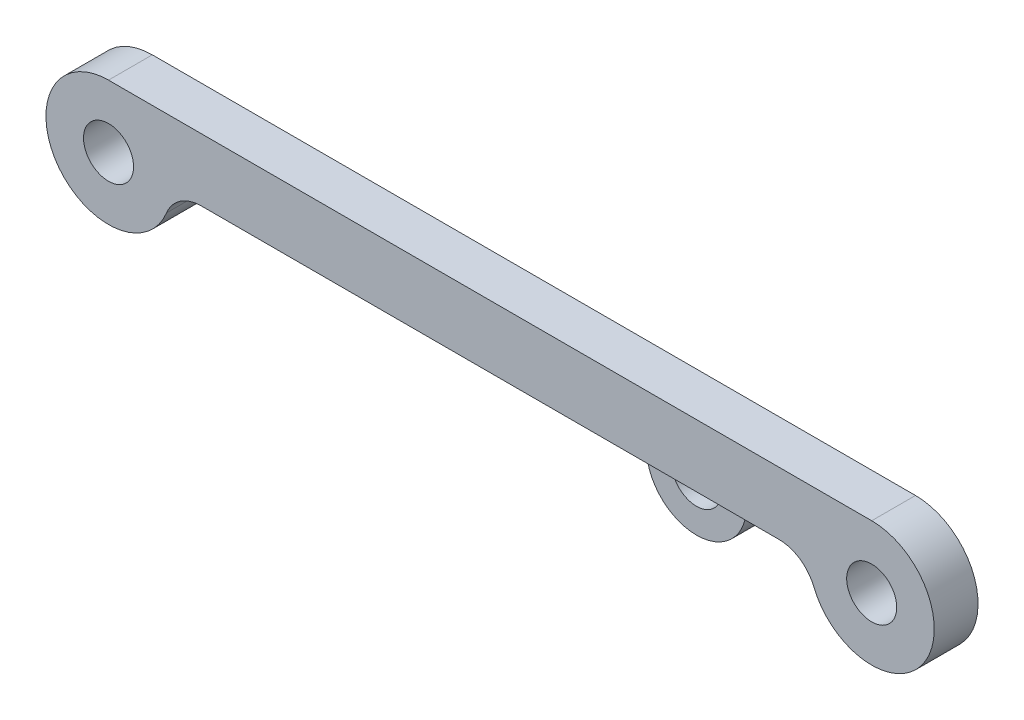
ISO-10303-21;
HEADER;
FILE_DESCRIPTION(('STEP AP214'),'2;1');
FILE_NAME('part.step','',(''),(''),'','','');
FILE_SCHEMA(('AUTOMOTIVE_DESIGN { 1 0 10303 214 1 1 1 1 }'));
ENDSEC;
DATA;
#1=APPLICATION_CONTEXT('core data for automotive mechanical design processes');
#2=APPLICATION_PROTOCOL_DEFINITION('international standard','automotive_design',2000,#1);
#3=PRODUCT_CONTEXT('',#1,'mechanical');
#4=PRODUCT('Part','Part','',(#3));
#5=PRODUCT_RELATED_PRODUCT_CATEGORY('part','',(#4));
#6=PRODUCT_DEFINITION_FORMATION('','',#4);
#7=PRODUCT_DEFINITION_CONTEXT('part definition',#1,'design');
#8=PRODUCT_DEFINITION('design','',#6,#7);
#9=PRODUCT_DEFINITION_SHAPE('','',#8);
#10=(LENGTH_UNIT() NAMED_UNIT(*) SI_UNIT(.MILLI.,.METRE.));
#11=(NAMED_UNIT(*) PLANE_ANGLE_UNIT() SI_UNIT($,.RADIAN.));
#12=(NAMED_UNIT(*) SI_UNIT($,.STERADIAN.) SOLID_ANGLE_UNIT());
#13=UNCERTAINTY_MEASURE_WITH_UNIT(LENGTH_MEASURE(1.E-05),#10,'distance_accuracy_value','');
#14=(GEOMETRIC_REPRESENTATION_CONTEXT(3) GLOBAL_UNCERTAINTY_ASSIGNED_CONTEXT((#13)) GLOBAL_UNIT_ASSIGNED_CONTEXT((#10,
#11,#12)) REPRESENTATION_CONTEXT('',''));
#15=CARTESIAN_POINT('',(0.,0.,0.));
#16=DIRECTION('',(0.,0.,1.));
#17=DIRECTION('',(1.,0.,0.));
#18=AXIS2_PLACEMENT_3D('',#15,#16,#17);
#19=CARTESIAN_POINT('',(-55.8049486568332,-0.499999999999997,3.5));
#20=DIRECTION('',(0.,1.,0.));
#21=DIRECTION('',(0.,0.,1.));
#22=AXIS2_PLACEMENT_3D('',#19,#20,#21);
#23=PLANE('',#22);
#24=DIRECTION('',(0.,0.,1.));
#25=VECTOR('',#24,1.);
#26=CARTESIAN_POINT('',(-12.3221676583625,-0.499999999999997,3.5));
#27=LINE('',#26,#25);
#28=CARTESIAN_POINT('',(-12.3221676583625,-0.499999999999997,2.5));
#29=VERTEX_POINT('',#28);
#30=CARTESIAN_POINT('',(-12.3221676583625,-0.499999999999997,0.5));
#31=VERTEX_POINT('',#30);
#32=EDGE_CURVE('E253',#29,#31,#27,.F.);
#33=ORIENTED_EDGE('',*,*,#32,.T.);
#34=DIRECTION('',(1.,0.,0.));
#35=VECTOR('',#34,1.);
#36=CARTESIAN_POINT('',(-55.8049486568332,-0.499999999999997,0.5));
#37=LINE('',#36,#35);
#38=CARTESIAN_POINT('',(-15.2211471439288,-0.499999999999997,0.5));
#39=VERTEX_POINT('',#38);
#40=EDGE_CURVE('E250',#39,#31,#37,.T.);
#41=ORIENTED_EDGE('',*,*,#40,.F.);
#42=DIRECTION('',(0.,0.,1.));
#43=VECTOR('',#42,1.);
#44=CARTESIAN_POINT('',(-15.2211471439288,-0.499999999999997,0.5));
#45=LINE('',#44,#43);
#46=CARTESIAN_POINT('',(-15.2211471439288,-0.499999999999997,2.5));
#47=VERTEX_POINT('',#46);
#48=EDGE_CURVE('E137',#39,#47,#45,.T.);
#49=ORIENTED_EDGE('',*,*,#48,.T.);
#50=DIRECTION('',(1.,0.,0.));
#51=VECTOR('',#50,1.);
#52=CARTESIAN_POINT('',(-55.8049486568332,-0.499999999999997,2.5));
#53=LINE('',#52,#51);
#54=EDGE_CURVE('E245',#47,#29,#53,.T.);
#55=ORIENTED_EDGE('',*,*,#54,.T.);
#56=EDGE_LOOP('',(#33,#41,#49,#55));
#57=FACE_BOUND('',#56,.T.);
#58=DIRECTION('',(1.,0.,0.));
#59=VECTOR('',#58,1.);
#60=CARTESIAN_POINT('',(-55.8049486568332,-0.499999999999997,0.));
#61=LINE('',#60,#59);
#62=CARTESIAN_POINT('',(-55.8049486568332,-0.499999999999997,0.));
#63=VERTEX_POINT('',#62);
#64=CARTESIAN_POINT('',(-9.63734563102448,-0.499999999999997,0.));
#65=VERTEX_POINT('',#64);
#66=EDGE_CURVE('E208',#63,#65,#61,.T.);
#67=ORIENTED_EDGE('',*,*,#66,.T.);
#68=DIRECTION('',(0.,0.,-1.));
#69=VECTOR('',#68,1.);
#70=CARTESIAN_POINT('',(-9.63734563102448,-0.499999999999997,3.5));
#71=LINE('',#70,#69);
#72=CARTESIAN_POINT('',(-9.63734563102448,-0.499999999999997,3.5));
#73=VERTEX_POINT('',#72);
#74=EDGE_CURVE('E237',#73,#65,#71,.T.);
#75=ORIENTED_EDGE('',*,*,#74,.F.);
#76=DIRECTION('',(1.,0.,0.));
#77=VECTOR('',#76,1.);
#78=CARTESIAN_POINT('',(-55.8049486568332,-0.499999999999997,3.5));
#79=LINE('',#78,#77);
#80=CARTESIAN_POINT('',(-55.8049486568332,-0.499999999999997,3.5));
#81=VERTEX_POINT('',#80);
#82=EDGE_CURVE('E188',#81,#73,#79,.T.);
#83=ORIENTED_EDGE('',*,*,#82,.F.);
#84=DIRECTION('',(0.,0.,-1.));
#85=VECTOR('',#84,1.);
#86=CARTESIAN_POINT('',(-55.8049486568332,-0.499999999999997,3.5));
#87=LINE('',#86,#85);
#88=EDGE_CURVE('E241',#81,#63,#87,.T.);
#89=ORIENTED_EDGE('',*,*,#88,.T.);
#90=EDGE_LOOP('',(#67,#75,#83,#89));
#91=FACE_BOUND('',#90,.T.);
#92=ADVANCED_FACE('F45',(#57,#91),#23,.F.);
#93=CARTESIAN_POINT('',(-55.8049486568332,-3.5,3.5));
#94=DIRECTION('',(0.,0.,1.));
#95=DIRECTION('',(1.,0.,0.));
#96=AXIS2_PLACEMENT_3D('',#93,#94,#95);
#97=PLANE('',#96);
#98=CARTESIAN_POINT('',(-63.2211471439288,-0.499999999999996,3.5));
#99=DIRECTION('',(0.,0.,1.));
#100=DIRECTION('',(1.,0.,0.));
#101=AXIS2_PLACEMENT_3D('',#98,#99,#100);
#102=CIRCLE('',#101,2.);
#103=CARTESIAN_POINT('',(-61.2211471439288,-0.499999999999996,3.5));
#104=VERTEX_POINT('',#103);
#105=EDGE_CURVE('E176',#104,#104,#102,.T.);
#106=ORIENTED_EDGE('',*,*,#105,.F.);
#107=EDGE_LOOP('',(#106));
#108=FACE_BOUND('',#107,.T.);
#109=CARTESIAN_POINT('',(-55.8049486568332,-3.5,3.5));
#110=DIRECTION('',(0.,0.,-1.));
#111=DIRECTION('',(1.,0.,0.));
#112=AXIS2_PLACEMENT_3D('',#109,#110,#111);
#113=CIRCLE('',#112,3.);
#114=CARTESIAN_POINT('',(-58.586023089494,-2.375,3.5));
#115=VERTEX_POINT('',#114);
#116=EDGE_CURVE('E184',#115,#81,#113,.T.);
#117=ORIENTED_EDGE('',*,*,#116,.T.);
#118=ORIENTED_EDGE('',*,*,#82,.T.);
#119=CARTESIAN_POINT('',(-9.63734563102448,-3.5,3.5));
#120=DIRECTION('',(0.,0.,-1.));
#121=DIRECTION('',(-1.,0.,0.));
#122=AXIS2_PLACEMENT_3D('',#119,#120,#121);
#123=CIRCLE('',#122,3.);
#124=CARTESIAN_POINT('',(-6.85627119836361,-2.375,3.5));
#125=VERTEX_POINT('',#124);
#126=EDGE_CURVE('E192',#73,#125,#123,.T.);
#127=ORIENTED_EDGE('',*,*,#126,.T.);
#128=CARTESIAN_POINT('',(-2.22114714392882,-0.499999999999997,3.5));
#129=DIRECTION('',(0.,0.,1.));
#130=DIRECTION('',(1.,0.,0.));
#131=AXIS2_PLACEMENT_3D('',#128,#129,#130);
#132=CIRCLE('',#131,5.);
#133=CARTESIAN_POINT('',(-2.22114714392882,4.5,3.5));
#134=VERTEX_POINT('',#133);
#135=EDGE_CURVE('E195',#125,#134,#132,.T.);
#136=ORIENTED_EDGE('',*,*,#135,.T.);
#137=DIRECTION('',(-1.,0.,0.));
#138=VECTOR('',#137,1.);
#139=CARTESIAN_POINT('',(-63.2211471439288,4.5,3.5));
#140=LINE('',#139,#138);
#141=CARTESIAN_POINT('',(-63.2211471439288,4.5,3.5));
#142=VERTEX_POINT('',#141);
#143=EDGE_CURVE('E198',#134,#142,#140,.T.);
#144=ORIENTED_EDGE('',*,*,#143,.T.);
#145=CARTESIAN_POINT('',(-63.2211471439288,-0.499999999999996,3.5));
#146=DIRECTION('',(0.,0.,1.));
#147=DIRECTION('',(1.,0.,0.));
#148=AXIS2_PLACEMENT_3D('',#145,#146,#147);
#149=CIRCLE('',#148,5.);
#150=EDGE_CURVE('E201',#142,#115,#149,.T.);
#151=ORIENTED_EDGE('',*,*,#150,.T.);
#152=EDGE_LOOP('',(#117,#118,#127,#136,#144,#151));
#153=FACE_BOUND('',#152,.T.);
#154=CARTESIAN_POINT('',(-2.22114714392882,-0.499999999999997,3.5));
#155=DIRECTION('',(0.,0.,1.));
#156=DIRECTION('',(1.,0.,0.));
#157=AXIS2_PLACEMENT_3D('',#154,#155,#156);
#158=CIRCLE('',#157,2.);
#159=CARTESIAN_POINT('',(-0.221147143928817,-0.499999999999997,3.5));
#160=VERTEX_POINT('',#159);
#161=EDGE_CURVE('E168',#160,#160,#158,.T.);
#162=ORIENTED_EDGE('',*,*,#161,.F.);
#163=EDGE_LOOP('',(#162));
#164=FACE_BOUND('',#163,.T.);
#165=ADVANCED_FACE('F281',(#108,#153,#164),#97,.T.);
#166=CARTESIAN_POINT('',(-55.8049486568332,-3.5,0.));
#167=DIRECTION('',(0.,0.,1.));
#168=DIRECTION('',(1.,0.,0.));
#169=AXIS2_PLACEMENT_3D('',#166,#167,#168);
#170=PLANE('',#169);
#171=CARTESIAN_POINT('',(-55.8049486568332,-3.5,0.));
#172=DIRECTION('',(0.,0.,-1.));
#173=DIRECTION('',(1.,0.,0.));
#174=AXIS2_PLACEMENT_3D('',#171,#172,#173);
#175=CIRCLE('',#174,3.);
#176=CARTESIAN_POINT('',(-58.586023089494,-2.375,0.));
#177=VERTEX_POINT('',#176);
#178=EDGE_CURVE('E180',#177,#63,#175,.T.);
#179=ORIENTED_EDGE('',*,*,#178,.F.);
#180=CARTESIAN_POINT('',(-63.2211471439288,-0.499999999999996,0.));
#181=DIRECTION('',(0.,0.,1.));
#182=DIRECTION('',(1.,0.,0.));
#183=AXIS2_PLACEMENT_3D('',#180,#181,#182);
#184=CIRCLE('',#183,5.);
#185=CARTESIAN_POINT('',(-63.2211471439288,4.5,0.));
#186=VERTEX_POINT('',#185);
#187=EDGE_CURVE('E189',#186,#177,#184,.T.);
#188=ORIENTED_EDGE('',*,*,#187,.F.);
#189=DIRECTION('',(-1.,0.,0.));
#190=VECTOR('',#189,1.);
#191=CARTESIAN_POINT('',(-63.2211471439288,4.5,0.));
#192=LINE('',#191,#190);
#193=CARTESIAN_POINT('',(-2.22114714392882,4.5,0.));
#194=VERTEX_POINT('',#193);
#195=EDGE_CURVE('E217',#194,#186,#192,.T.);
#196=ORIENTED_EDGE('',*,*,#195,.F.);
#197=CARTESIAN_POINT('',(-2.22114714392882,-0.499999999999997,0.));
#198=DIRECTION('',(0.,0.,1.));
#199=DIRECTION('',(1.,0.,0.));
#200=AXIS2_PLACEMENT_3D('',#197,#198,#199);
#201=CIRCLE('',#200,5.);
#202=CARTESIAN_POINT('',(-6.85627119836361,-2.375,0.));
#203=VERTEX_POINT('',#202);
#204=EDGE_CURVE('E214',#203,#194,#201,.T.);
#205=ORIENTED_EDGE('',*,*,#204,.F.);
#206=CARTESIAN_POINT('',(-9.63734563102448,-3.5,0.));
#207=DIRECTION('',(0.,0.,-1.));
#208=DIRECTION('',(-1.,0.,0.));
#209=AXIS2_PLACEMENT_3D('',#206,#207,#208);
#210=CIRCLE('',#209,3.);
#211=EDGE_CURVE('E211',#65,#203,#210,.T.);
#212=ORIENTED_EDGE('',*,*,#211,.F.);
#213=ORIENTED_EDGE('',*,*,#66,.F.);
#214=EDGE_LOOP('',(#179,#188,#196,#205,#212,#213));
#215=FACE_BOUND('',#214,.T.);
#216=CARTESIAN_POINT('',(-63.2211471439288,-0.499999999999996,0.));
#217=DIRECTION('',(0.,0.,1.));
#218=DIRECTION('',(1.,0.,0.));
#219=AXIS2_PLACEMENT_3D('',#216,#217,#218);
#220=CIRCLE('',#219,2.);
#221=CARTESIAN_POINT('',(-61.2211471439288,-0.499999999999996,0.));
#222=VERTEX_POINT('',#221);
#223=EDGE_CURVE('E172',#222,#222,#220,.T.);
#224=ORIENTED_EDGE('',*,*,#223,.T.);
#225=EDGE_LOOP('',(#224));
#226=FACE_BOUND('',#225,.T.);
#227=CARTESIAN_POINT('',(-2.22114714392882,-0.499999999999997,0.));
#228=DIRECTION('',(0.,0.,1.));
#229=DIRECTION('',(1.,0.,0.));
#230=AXIS2_PLACEMENT_3D('',#227,#228,#229);
#231=CIRCLE('',#230,2.);
#232=CARTESIAN_POINT('',(-0.221147143928817,-0.499999999999997,0.));
#233=VERTEX_POINT('',#232);
#234=EDGE_CURVE('E166',#233,#233,#231,.T.);
#235=ORIENTED_EDGE('',*,*,#234,.T.);
#236=EDGE_LOOP('',(#235));
#237=FACE_BOUND('',#236,.T.);
#238=ADVANCED_FACE('F287',(#215,#226,#237),#170,.F.);
#239=CARTESIAN_POINT('',(-55.8049486568332,-3.5,3.5));
#240=DIRECTION('',(0.,0.,-1.));
#241=DIRECTION('',(-1.,0.,0.));
#242=AXIS2_PLACEMENT_3D('',#239,#240,#241);
#243=CYLINDRICAL_SURFACE('',#242,3.);
#244=ORIENTED_EDGE('',*,*,#178,.T.);
#245=ORIENTED_EDGE('',*,*,#88,.F.);
#246=ORIENTED_EDGE('',*,*,#116,.F.);
#247=DIRECTION('',(0.,0.,-1.));
#248=VECTOR('',#247,1.);
#249=CARTESIAN_POINT('',(-58.586023089494,-2.375,3.5));
#250=LINE('',#249,#248);
#251=EDGE_CURVE('E204',#115,#177,#250,.T.);
#252=ORIENTED_EDGE('',*,*,#251,.T.);
#253=EDGE_LOOP('',(#244,#245,#246,#252));
#254=FACE_BOUND('',#253,.T.);
#255=ADVANCED_FACE('F293',(#254),#243,.F.);
#256=CARTESIAN_POINT('',(-9.63734563102448,-3.5,3.5));
#257=DIRECTION('',(0.,0.,-1.));
#258=DIRECTION('',(-1.,0.,0.));
#259=AXIS2_PLACEMENT_3D('',#256,#257,#258);
#260=CYLINDRICAL_SURFACE('',#259,3.);
#261=ORIENTED_EDGE('',*,*,#211,.T.);
#262=DIRECTION('',(0.,0.,-1.));
#263=VECTOR('',#262,1.);
#264=CARTESIAN_POINT('',(-6.85627119836361,-2.375,3.5));
#265=LINE('',#264,#263);
#266=EDGE_CURVE('E233',#125,#203,#265,.T.);
#267=ORIENTED_EDGE('',*,*,#266,.F.);
#268=ORIENTED_EDGE('',*,*,#126,.F.);
#269=ORIENTED_EDGE('',*,*,#74,.T.);
#270=EDGE_LOOP('',(#261,#267,#268,#269));
#271=FACE_BOUND('',#270,.T.);
#272=ADVANCED_FACE('F291',(#271),#260,.F.);
#273=CARTESIAN_POINT('',(-2.22114714392882,-0.499999999999997,3.5));
#274=DIRECTION('',(0.,0.,-1.));
#275=DIRECTION('',(-1.,0.,0.));
#276=AXIS2_PLACEMENT_3D('',#273,#274,#275);
#277=CYLINDRICAL_SURFACE('',#276,5.);
#278=ORIENTED_EDGE('',*,*,#204,.T.);
#279=DIRECTION('',(0.,0.,-1.));
#280=VECTOR('',#279,1.);
#281=CARTESIAN_POINT('',(-2.22114714392882,4.5,3.5));
#282=LINE('',#281,#280);
#283=EDGE_CURVE('E229',#134,#194,#282,.T.);
#284=ORIENTED_EDGE('',*,*,#283,.F.);
#285=ORIENTED_EDGE('',*,*,#135,.F.);
#286=ORIENTED_EDGE('',*,*,#266,.T.);
#287=EDGE_LOOP('',(#278,#284,#285,#286));
#288=FACE_BOUND('',#287,.T.);
#289=ADVANCED_FACE('F300',(#288),#277,.T.);
#290=CARTESIAN_POINT('',(-63.2211471439288,4.5,3.5));
#291=DIRECTION('',(0.,-1.,0.));
#292=DIRECTION('',(1.,0.,0.));
#293=AXIS2_PLACEMENT_3D('',#290,#291,#292);
#294=PLANE('',#293);
#295=ORIENTED_EDGE('',*,*,#195,.T.);
#296=DIRECTION('',(0.,0.,-1.));
#297=VECTOR('',#296,1.);
#298=CARTESIAN_POINT('',(-63.2211471439288,4.5,3.5));
#299=LINE('',#298,#297);
#300=EDGE_CURVE('E225',#142,#186,#299,.T.);
#301=ORIENTED_EDGE('',*,*,#300,.F.);
#302=ORIENTED_EDGE('',*,*,#143,.F.);
#303=ORIENTED_EDGE('',*,*,#283,.T.);
#304=EDGE_LOOP('',(#295,#301,#302,#303));
#305=FACE_BOUND('',#304,.T.);
#306=ADVANCED_FACE('F323',(#305),#294,.F.);
#307=CARTESIAN_POINT('',(-63.2211471439288,-0.499999999999996,3.5));
#308=DIRECTION('',(0.,0.,-1.));
#309=DIRECTION('',(-1.,0.,0.));
#310=AXIS2_PLACEMENT_3D('',#307,#308,#309);
#311=CYLINDRICAL_SURFACE('',#310,5.);
#312=ORIENTED_EDGE('',*,*,#187,.T.);
#313=ORIENTED_EDGE('',*,*,#251,.F.);
#314=ORIENTED_EDGE('',*,*,#150,.F.);
#315=ORIENTED_EDGE('',*,*,#300,.T.);
#316=EDGE_LOOP('',(#312,#313,#314,#315));
#317=FACE_BOUND('',#316,.T.);
#318=ADVANCED_FACE('F321',(#317),#311,.T.);
#319=CARTESIAN_POINT('',(-63.2211471439288,-0.499999999999996,3.5));
#320=DIRECTION('',(0.,0.,-1.));
#321=DIRECTION('',(-1.,0.,0.));
#322=AXIS2_PLACEMENT_3D('',#319,#320,#321);
#323=CYLINDRICAL_SURFACE('',#322,2.);
#324=ORIENTED_EDGE('',*,*,#105,.T.);
#325=EDGE_LOOP('',(#324));
#326=FACE_BOUND('',#325,.T.);
#327=ORIENTED_EDGE('',*,*,#223,.F.);
#328=EDGE_LOOP('',(#327));
#329=FACE_BOUND('',#328,.T.);
#330=ADVANCED_FACE('F278',(#326,#329),#323,.F.);
#331=CARTESIAN_POINT('',(-2.22114714392882,-0.499999999999997,3.5));
#332=DIRECTION('',(0.,0.,-1.));
#333=DIRECTION('',(-1.,0.,0.));
#334=AXIS2_PLACEMENT_3D('',#331,#332,#333);
#335=CYLINDRICAL_SURFACE('',#334,2.);
#336=ORIENTED_EDGE('',*,*,#161,.T.);
#337=EDGE_LOOP('',(#336));
#338=FACE_BOUND('',#337,.T.);
#339=ORIENTED_EDGE('',*,*,#234,.F.);
#340=EDGE_LOOP('',(#339));
#341=FACE_BOUND('',#340,.T.);
#342=ADVANCED_FACE('F269',(#338,#341),#335,.F.);
#343=CARTESIAN_POINT('',(-17.2211471439288,-0.499999999999997,0.5));
#344=DIRECTION('',(0.,0.,1.));
#345=DIRECTION('',(1.,0.,0.));
#346=AXIS2_PLACEMENT_3D('',#343,#344,#345);
#347=CYLINDRICAL_SURFACE('',#346,4.);
#348=CARTESIAN_POINT('',(-17.2211471439288,-0.499999999999997,0.5));
#349=DIRECTION('',(0.,0.,1.));
#350=DIRECTION('',(1.,0.,0.));
#351=AXIS2_PLACEMENT_3D('',#348,#349,#350);
#352=CIRCLE('',#351,4.);
#353=CARTESIAN_POINT('',(-21.1272374526299,-1.36166031605952,0.5));
#354=VERTEX_POINT('',#353);
#355=CARTESIAN_POINT('',(-13.3019635554757,-1.3,0.5));
#356=VERTEX_POINT('',#355);
#357=EDGE_CURVE('E142',#354,#356,#352,.T.);
#358=ORIENTED_EDGE('',*,*,#357,.T.);
#359=DIRECTION('',(0.,0.,1.));
#360=VECTOR('',#359,1.);
#361=CARTESIAN_POINT('',(-13.3019635554757,-1.3,0.5));
#362=LINE('',#361,#360);
#363=CARTESIAN_POINT('',(-13.3019635554757,-1.3,2.5));
#364=VERTEX_POINT('',#363);
#365=EDGE_CURVE('E67',#356,#364,#362,.T.);
#366=ORIENTED_EDGE('',*,*,#365,.T.);
#367=CARTESIAN_POINT('',(-17.2211471439288,-0.499999999999997,2.5));
#368=DIRECTION('',(0.,0.,1.));
#369=DIRECTION('',(1.,0.,0.));
#370=AXIS2_PLACEMENT_3D('',#367,#368,#369);
#371=CIRCLE('',#370,4.);
#372=CARTESIAN_POINT('',(-21.1272374526299,-1.36166031605952,2.5));
#373=VERTEX_POINT('',#372);
#374=EDGE_CURVE('E157',#373,#364,#371,.T.);
#375=ORIENTED_EDGE('',*,*,#374,.F.);
#376=DIRECTION('',(0.,0.,1.));
#377=VECTOR('',#376,1.);
#378=CARTESIAN_POINT('',(-21.1272374526299,-1.36166031605952,0.5));
#379=LINE('',#378,#377);
#380=EDGE_CURVE('E150',#354,#373,#379,.T.);
#381=ORIENTED_EDGE('',*,*,#380,.F.);
#382=EDGE_LOOP('',(#358,#366,#375,#381));
#383=FACE_BOUND('',#382,.T.);
#384=ADVANCED_FACE('F266',(#383),#347,.T.);
#385=CARTESIAN_POINT('',(-17.2211471439288,-0.499999999999997,0.5));
#386=DIRECTION('',(0.,0.,1.));
#387=DIRECTION('',(1.,0.,0.));
#388=AXIS2_PLACEMENT_3D('',#385,#386,#387);
#389=CYLINDRICAL_SURFACE('',#388,2.);
#390=ORIENTED_EDGE('',*,*,#48,.F.);
#391=CARTESIAN_POINT('',(-17.2211471439288,-0.499999999999997,0.5));
#392=DIRECTION('',(0.,0.,-1.));
#393=DIRECTION('',(1.,0.,0.));
#394=AXIS2_PLACEMENT_3D('',#391,#392,#393);
#395=CIRCLE('',#394,2.);
#396=CARTESIAN_POINT('',(-19.0260132053661,-1.36166031605952,0.5));
#397=VERTEX_POINT('',#396);
#398=EDGE_CURVE('E130',#39,#397,#395,.T.);
#399=ORIENTED_EDGE('',*,*,#398,.T.);
#400=DIRECTION('',(0.,0.,1.));
#401=VECTOR('',#400,1.);
#402=CARTESIAN_POINT('',(-19.0260132053661,-1.36166031605952,0.5));
#403=LINE('',#402,#401);
#404=CARTESIAN_POINT('',(-19.0260132053661,-1.36166031605952,2.5));
#405=VERTEX_POINT('',#404);
#406=EDGE_CURVE('E134',#397,#405,#403,.T.);
#407=ORIENTED_EDGE('',*,*,#406,.T.);
#408=CARTESIAN_POINT('',(-17.2211471439288,-0.499999999999997,2.5));
#409=DIRECTION('',(0.,0.,-1.));
#410=DIRECTION('',(1.,0.,0.));
#411=AXIS2_PLACEMENT_3D('',#408,#409,#410);
#412=CIRCLE('',#411,2.);
#413=EDGE_CURVE('E160',#47,#405,#412,.T.);
#414=ORIENTED_EDGE('',*,*,#413,.F.);
#415=EDGE_LOOP('',(#390,#399,#407,#414));
#416=FACE_BOUND('',#415,.T.);
#417=ADVANCED_FACE('F132',(#416),#389,.F.);
#418=CARTESIAN_POINT('',(-17.2211471439288,-0.499999999999997,0.5));
#419=DIRECTION('',(0.,0.,1.));
#420=DIRECTION('',(1.,0.,0.));
#421=AXIS2_PLACEMENT_3D('',#418,#419,#420);
#422=PLANE('',#421);
#423=ORIENTED_EDGE('',*,*,#398,.F.);
#424=ORIENTED_EDGE('',*,*,#40,.T.);
#425=CARTESIAN_POINT('',(-12.3221676583625,-1.5,0.5));
#426=DIRECTION('',(0.,0.,1.));
#427=DIRECTION('',(1.,0.,0.));
#428=AXIS2_PLACEMENT_3D('',#425,#426,#427);
#429=CIRCLE('',#428,1.);
#430=EDGE_CURVE('E54',#31,#356,#429,.T.);
#431=ORIENTED_EDGE('',*,*,#430,.T.);
#432=ORIENTED_EDGE('',*,*,#357,.F.);
#433=DIRECTION('',(-1.,0.,0.));
#434=VECTOR('',#433,1.);
#435=CARTESIAN_POINT('',(-21.1272374526299,-1.36166031605952,0.5));
#436=LINE('',#435,#434);
#437=EDGE_CURVE('E141',#397,#354,#436,.T.);
#438=ORIENTED_EDGE('',*,*,#437,.F.);
#439=EDGE_LOOP('',(#423,#424,#431,#432,#438));
#440=FACE_BOUND('',#439,.T.);
#441=ADVANCED_FACE('F152',(#440),#422,.F.);
#442=CARTESIAN_POINT('',(-17.2211471439288,-0.499999999999997,2.5));
#443=DIRECTION('',(0.,0.,1.));
#444=DIRECTION('',(1.,0.,0.));
#445=AXIS2_PLACEMENT_3D('',#442,#443,#444);
#446=PLANE('',#445);
#447=ORIENTED_EDGE('',*,*,#54,.F.);
#448=ORIENTED_EDGE('',*,*,#413,.T.);
#449=DIRECTION('',(-1.,0.,0.));
#450=VECTOR('',#449,1.);
#451=CARTESIAN_POINT('',(-21.1272374526299,-1.36166031605952,2.5));
#452=LINE('',#451,#450);
#453=EDGE_CURVE('E148',#405,#373,#452,.T.);
#454=ORIENTED_EDGE('',*,*,#453,.T.);
#455=ORIENTED_EDGE('',*,*,#374,.T.);
#456=CARTESIAN_POINT('',(-12.3221676583625,-1.5,2.5));
#457=DIRECTION('',(0.,0.,1.));
#458=DIRECTION('',(1.,0.,0.));
#459=AXIS2_PLACEMENT_3D('',#456,#457,#458);
#460=CIRCLE('',#459,1.);
#461=EDGE_CURVE('E11',#364,#29,#460,.F.);
#462=ORIENTED_EDGE('',*,*,#461,.T.);
#463=EDGE_LOOP('',(#447,#448,#454,#455,#462));
#464=FACE_BOUND('',#463,.T.);
#465=ADVANCED_FACE('F265',(#464),#446,.T.);
#466=CARTESIAN_POINT('',(-21.1272374526299,-1.36166031605952,0.5));
#467=DIRECTION('',(0.,1.,0.));
#468=DIRECTION('',(0.,0.,1.));
#469=AXIS2_PLACEMENT_3D('',#466,#467,#468);
#470=PLANE('',#469);
#471=ORIENTED_EDGE('',*,*,#453,.F.);
#472=ORIENTED_EDGE('',*,*,#406,.F.);
#473=ORIENTED_EDGE('',*,*,#437,.T.);
#474=ORIENTED_EDGE('',*,*,#380,.T.);
#475=EDGE_LOOP('',(#471,#472,#473,#474));
#476=FACE_BOUND('',#475,.T.);
#477=ADVANCED_FACE('F146',(#476),#470,.T.);
#478=CARTESIAN_POINT('',(-12.3221676583625,-1.5,0.5));
#479=DIRECTION('',(0.,0.,1.));
#480=DIRECTION('',(1.,0.,0.));
#481=AXIS2_PLACEMENT_3D('',#478,#479,#480);
#482=CYLINDRICAL_SURFACE('',#481,1.);
#483=ORIENTED_EDGE('',*,*,#461,.F.);
#484=ORIENTED_EDGE('',*,*,#365,.F.);
#485=ORIENTED_EDGE('',*,*,#430,.F.);
#486=ORIENTED_EDGE('',*,*,#32,.F.);
#487=EDGE_LOOP('',(#483,#484,#485,#486));
#488=FACE_BOUND('',#487,.T.);
#489=ADVANCED_FACE('F47',(#488),#482,.F.);
#490=CLOSED_SHELL('',(#92,#165,#238,#255,#272,#289,#306,#318,#330,#342,#384,#417,#441,#465,#477,#489));
#491=MANIFOLD_SOLID_BREP('B2',#490);
#492=ADVANCED_BREP_SHAPE_REPRESENTATION('',(#18,#491),#14);
#493=SHAPE_DEFINITION_REPRESENTATION(#9,#492);
ENDSEC;
END-ISO-10303-21;
